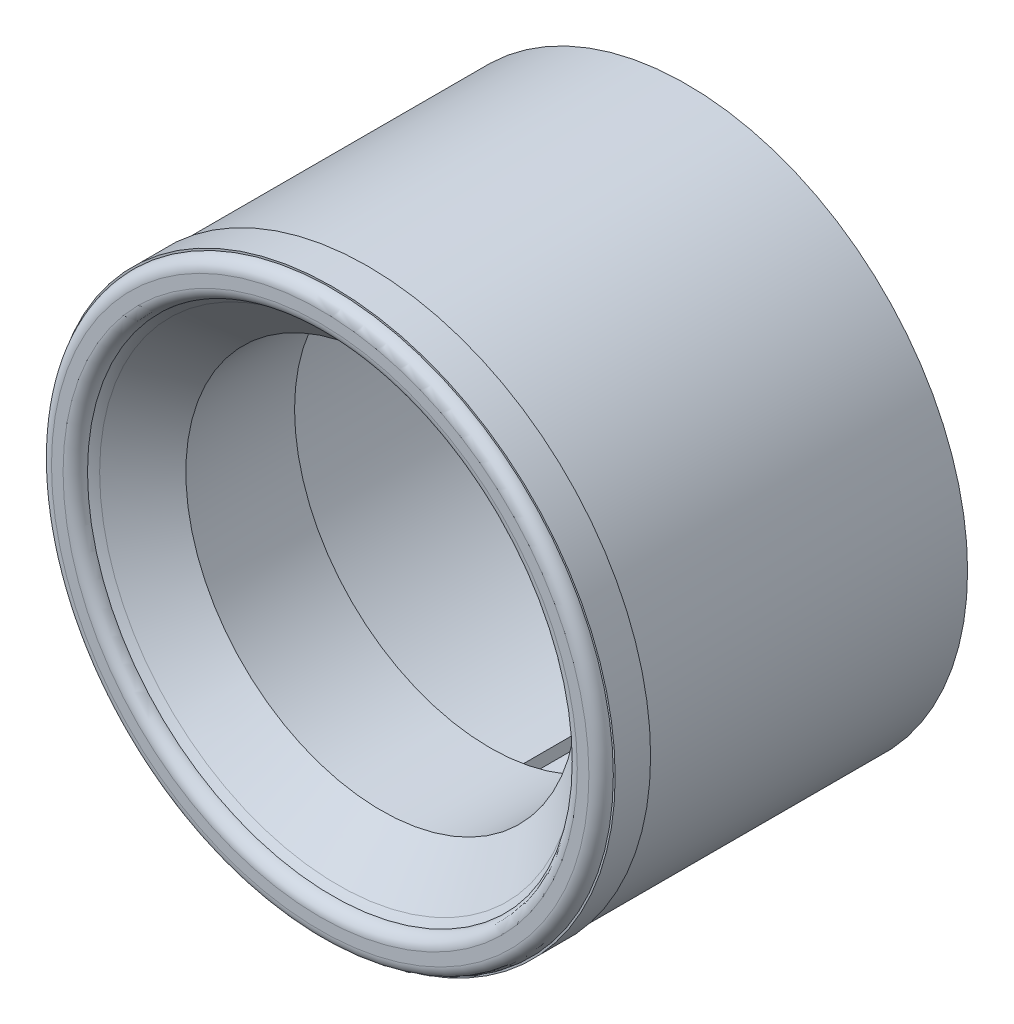
ISO-10303-21;
HEADER;
FILE_DESCRIPTION(('STEP AP214'),'2;1');
FILE_NAME('part.step','',(''),(''),'','','');
FILE_SCHEMA(('AUTOMOTIVE_DESIGN { 1 0 10303 214 1 1 1 1 }'));
ENDSEC;
DATA;
#1=APPLICATION_CONTEXT('core data for automotive mechanical design processes');
#2=APPLICATION_PROTOCOL_DEFINITION('international standard','automotive_design',2000,#1);
#3=PRODUCT_CONTEXT('',#1,'mechanical');
#4=PRODUCT('Part','Part','',(#3));
#5=PRODUCT_RELATED_PRODUCT_CATEGORY('part','',(#4));
#6=PRODUCT_DEFINITION_FORMATION('','',#4);
#7=PRODUCT_DEFINITION_CONTEXT('part definition',#1,'design');
#8=PRODUCT_DEFINITION('design','',#6,#7);
#9=PRODUCT_DEFINITION_SHAPE('','',#8);
#10=(LENGTH_UNIT() NAMED_UNIT(*) SI_UNIT(.MILLI.,.METRE.));
#11=(NAMED_UNIT(*) PLANE_ANGLE_UNIT() SI_UNIT($,.RADIAN.));
#12=(NAMED_UNIT(*) SI_UNIT($,.STERADIAN.) SOLID_ANGLE_UNIT());
#13=UNCERTAINTY_MEASURE_WITH_UNIT(LENGTH_MEASURE(1.E-05),#10,'distance_accuracy_value','');
#14=(GEOMETRIC_REPRESENTATION_CONTEXT(3) GLOBAL_UNCERTAINTY_ASSIGNED_CONTEXT((#13)) GLOBAL_UNIT_ASSIGNED_CONTEXT((#10,
#11,#12)) REPRESENTATION_CONTEXT('',''));
#15=CARTESIAN_POINT('',(0.,0.,0.));
#16=DIRECTION('',(0.,0.,1.));
#17=DIRECTION('',(1.,0.,0.));
#18=AXIS2_PLACEMENT_3D('',#15,#16,#17);
#19=CARTESIAN_POINT('',(0.,0.,26.1));
#20=DIRECTION('',(0.,0.,1.));
#21=DIRECTION('',(1.,0.,0.));
#22=AXIS2_PLACEMENT_3D('',#19,#20,#21);
#23=PLANE('',#22);
#24=CARTESIAN_POINT('',(0.,0.,26.1));
#25=DIRECTION('',(0.,0.,1.));
#26=DIRECTION('',(1.,0.,0.));
#27=AXIS2_PLACEMENT_3D('',#24,#25,#26);
#28=CIRCLE('',#27,20.05);
#29=CARTESIAN_POINT('',(20.05,0.,26.1));
#30=VERTEX_POINT('',#29);
#31=EDGE_CURVE('E121',#30,#30,#28,.T.);
#32=ORIENTED_EDGE('',*,*,#31,.F.);
#33=EDGE_LOOP('',(#32));
#34=FACE_BOUND('',#33,.T.);
#35=CARTESIAN_POINT('',(0.,0.,26.1));
#36=DIRECTION('',(0.,0.,1.));
#37=DIRECTION('',(1.,0.,0.));
#38=AXIS2_PLACEMENT_3D('',#35,#36,#37);
#39=CIRCLE('',#38,17.425);
#40=CARTESIAN_POINT('',(17.425,0.,26.1));
#41=VERTEX_POINT('',#40);
#42=EDGE_CURVE('E420',#41,#41,#39,.F.);
#43=ORIENTED_EDGE('',*,*,#42,.F.);
#44=EDGE_LOOP('',(#43));
#45=FACE_BOUND('',#44,.T.);
#46=ADVANCED_FACE('F33',(#34,#45),#23,.F.);
#47=CARTESIAN_POINT('',(0.,0.,30.));
#48=DIRECTION('',(0.,0.,-1.));
#49=DIRECTION('',(-1.,0.,0.));
#50=AXIS2_PLACEMENT_3D('',#47,#48,#49);
#51=CYLINDRICAL_SURFACE('',#50,20.05);
#52=DIRECTION('',(0.,0.,-1.));
#53=VECTOR('',#52,1.);
#54=CARTESIAN_POINT('',(1.5,-19.9938115425749,30.));
#55=LINE('',#54,#53);
#56=CARTESIAN_POINT('',(1.5,-19.9938115425749,0.500000000000007));
#57=VERTEX_POINT('',#56);
#58=CARTESIAN_POINT('',(1.5,-19.9938115425749,26.));
#59=VERTEX_POINT('',#58);
#60=EDGE_CURVE('E48',#57,#59,#55,.F.);
#61=ORIENTED_EDGE('',*,*,#60,.T.);
#62=CARTESIAN_POINT('',(0.,0.,26.));
#63=DIRECTION('',(0.,0.,1.));
#64=DIRECTION('',(1.,0.,0.));
#65=AXIS2_PLACEMENT_3D('',#62,#63,#64);
#66=CIRCLE('',#65,20.05);
#67=CARTESIAN_POINT('',(-1.5,-19.9938115425749,26.));
#68=VERTEX_POINT('',#67);
#69=EDGE_CURVE('E250',#59,#68,#66,.F.);
#70=ORIENTED_EDGE('',*,*,#69,.T.);
#71=DIRECTION('',(0.,0.,-1.));
#72=VECTOR('',#71,1.);
#73=CARTESIAN_POINT('',(-1.5,-19.9938115425749,30.));
#74=LINE('',#73,#72);
#75=CARTESIAN_POINT('',(-1.5,-19.9938115425749,0.500000000000009));
#76=VERTEX_POINT('',#75);
#77=EDGE_CURVE('E56',#68,#76,#74,.T.);
#78=ORIENTED_EDGE('',*,*,#77,.T.);
#79=CARTESIAN_POINT('',(0.,0.,0.500000000000007));
#80=DIRECTION('',(0.,0.,1.));
#81=DIRECTION('',(1.,0.,0.));
#82=AXIS2_PLACEMENT_3D('',#79,#80,#81);
#83=CIRCLE('',#82,20.05);
#84=EDGE_CURVE('E144',#76,#57,#83,.F.);
#85=ORIENTED_EDGE('',*,*,#84,.T.);
#86=EDGE_LOOP('',(#61,#70,#78,#85));
#87=FACE_BOUND('',#86,.T.);
#88=ORIENTED_EDGE('',*,*,#31,.T.);
#89=EDGE_LOOP('',(#88));
#90=FACE_BOUND('',#89,.T.);
#91=ADVANCED_FACE('F206',(#87,#90),#51,.F.);
#92=CARTESIAN_POINT('',(0.,0.,30.));
#93=DIRECTION('',(0.,0.,-1.));
#94=DIRECTION('',(-1.,0.,0.));
#95=AXIS2_PLACEMENT_3D('',#92,#93,#94);
#96=CYLINDRICAL_SURFACE('',#95,23.);
#97=CARTESIAN_POINT('',(0.,0.,0.));
#98=DIRECTION('',(0.,0.,1.));
#99=DIRECTION('',(1.,0.,0.));
#100=AXIS2_PLACEMENT_3D('',#97,#98,#99);
#101=CIRCLE('',#100,23.);
#102=CARTESIAN_POINT('',(23.,0.,0.));
#103=VERTEX_POINT('',#102);
#104=EDGE_CURVE('E126',#103,#103,#101,.T.);
#105=ORIENTED_EDGE('',*,*,#104,.T.);
#106=EDGE_LOOP('',(#105));
#107=FACE_BOUND('',#106,.T.);
#108=CARTESIAN_POINT('',(0.,0.,26.1));
#109=DIRECTION('',(0.,0.,1.));
#110=DIRECTION('',(1.,0.,0.));
#111=AXIS2_PLACEMENT_3D('',#108,#109,#110);
#112=CIRCLE('',#111,23.);
#113=CARTESIAN_POINT('',(23.,0.,26.1));
#114=VERTEX_POINT('',#113);
#115=EDGE_CURVE('E178',#114,#114,#112,.T.);
#116=ORIENTED_EDGE('',*,*,#115,.F.);
#117=EDGE_LOOP('',(#116));
#118=FACE_BOUND('',#117,.T.);
#119=ADVANCED_FACE('F212',(#107,#118),#96,.T.);
#120=CARTESIAN_POINT('',(0.,0.,25.));
#121=DIRECTION('',(0.,0.,1.));
#122=DIRECTION('',(1.,0.,0.));
#123=AXIS2_PLACEMENT_3D('',#120,#121,#122);
#124=PLANE('',#123);
#125=DIRECTION('',(0.,-1.,0.));
#126=VECTOR('',#125,1.);
#127=CARTESIAN_POINT('',(-1.5,-19.05,25.));
#128=LINE('',#127,#126);
#129=CARTESIAN_POINT('',(-1.5,-20.9964878015348,25.));
#130=VERTEX_POINT('',#129);
#131=CARTESIAN_POINT('',(-1.5,-21.05,25.));
#132=VERTEX_POINT('',#131);
#133=EDGE_CURVE('E87',#130,#132,#128,.T.);
#134=ORIENTED_EDGE('',*,*,#133,.F.);
#135=CARTESIAN_POINT('',(0.,0.,25.));
#136=DIRECTION('',(0.,0.,1.));
#137=DIRECTION('',(1.,0.,0.));
#138=AXIS2_PLACEMENT_3D('',#135,#136,#137);
#139=CIRCLE('',#138,21.05);
#140=CARTESIAN_POINT('',(0.,-21.05,25.));
#141=VERTEX_POINT('',#140);
#142=EDGE_CURVE('E111',#130,#141,#139,.T.);
#143=ORIENTED_EDGE('',*,*,#142,.T.);
#144=DIRECTION('',(1.,0.,0.));
#145=VECTOR('',#144,1.);
#146=CARTESIAN_POINT('',(-1.5,-21.05,25.));
#147=LINE('',#146,#145);
#148=EDGE_CURVE('E104',#132,#141,#147,.T.);
#149=ORIENTED_EDGE('',*,*,#148,.F.);
#150=EDGE_LOOP('',(#134,#143,#149));
#151=FACE_BOUND('',#150,.T.);
#152=ADVANCED_FACE('F110',(#151),#124,.F.);
#153=CARTESIAN_POINT('',(0.,0.,0.));
#154=DIRECTION('',(0.,0.,1.));
#155=DIRECTION('',(1.,0.,0.));
#156=AXIS2_PLACEMENT_3D('',#153,#154,#155);
#157=PLANE('',#156);
#158=ORIENTED_EDGE('',*,*,#104,.F.);
#159=EDGE_LOOP('',(#158));
#160=FACE_BOUND('',#159,.T.);
#161=DIRECTION('',(0.,1.,0.));
#162=VECTOR('',#161,1.);
#163=CARTESIAN_POINT('',(1.5,-19.05,0.));
#164=LINE('',#163,#162);
#165=CARTESIAN_POINT('',(1.5,-21.05,0.));
#166=VERTEX_POINT('',#165);
#167=CARTESIAN_POINT('',(1.5,-20.4951823607403,0.));
#168=VERTEX_POINT('',#167);
#169=EDGE_CURVE('E117',#166,#168,#164,.T.);
#170=ORIENTED_EDGE('',*,*,#169,.T.);
#171=CARTESIAN_POINT('',(0.,0.,0.));
#172=DIRECTION('',(0.,0.,1.));
#173=DIRECTION('',(1.,0.,0.));
#174=AXIS2_PLACEMENT_3D('',#171,#172,#173);
#175=CIRCLE('',#174,20.55);
#176=CARTESIAN_POINT('',(-1.5,-20.4951823607403,0.));
#177=VERTEX_POINT('',#176);
#178=EDGE_CURVE('E141',#168,#177,#175,.T.);
#179=ORIENTED_EDGE('',*,*,#178,.T.);
#180=DIRECTION('',(0.,-1.,0.));
#181=VECTOR('',#180,1.);
#182=CARTESIAN_POINT('',(-1.5,-19.05,0.));
#183=LINE('',#182,#181);
#184=CARTESIAN_POINT('',(-1.5,-21.05,0.));
#185=VERTEX_POINT('',#184);
#186=EDGE_CURVE('E120',#177,#185,#183,.T.);
#187=ORIENTED_EDGE('',*,*,#186,.T.);
#188=DIRECTION('',(1.,0.,0.));
#189=VECTOR('',#188,1.);
#190=CARTESIAN_POINT('',(-1.5,-21.05,0.));
#191=LINE('',#190,#189);
#192=EDGE_CURVE('E106',#185,#166,#191,.T.);
#193=ORIENTED_EDGE('',*,*,#192,.T.);
#194=EDGE_LOOP('',(#170,#179,#187,#193));
#195=FACE_BOUND('',#194,.T.);
#196=ADVANCED_FACE('F258',(#160,#195),#157,.F.);
#197=CARTESIAN_POINT('',(0.,0.,0.));
#198=DIRECTION('',(0.,0.,-1.));
#199=DIRECTION('',(-1.,0.,0.));
#200=AXIS2_PLACEMENT_3D('',#197,#198,#199);
#201=CONICAL_SURFACE('',#200,20.55,0.785398163397438);
#202=ORIENTED_EDGE('',*,*,#178,.F.);
#203=CARTESIAN_POINT('',(1.5,-22.4903904809033,-1.99035634109423));
#204=CARTESIAN_POINT('',(1.5,-21.7615888523124,-1.26312854031562));
#205=CARTESIAN_POINT('',(1.5,-21.0326797089882,-0.536008550704387));
#206=CARTESIAN_POINT('',(1.5,-19.5746463894473,0.918015809599295));
#207=CARTESIAN_POINT('',(1.5,-18.8455222132297,1.64492018029074));
#208=CARTESIAN_POINT('',(1.5,-18.1162905222777,2.37171673981378));
#209=B_SPLINE_CURVE_WITH_KNOTS('',3,(#203,#204,#205,#206,#207,#208),.UNSPECIFIED.,.F.,.F.,(4,2,
4),(0.,3.08870655236552,6.17741311924391),.UNSPECIFIED.);
#210=EDGE_CURVE('E154',#168,#57,#209,.T.);
#211=ORIENTED_EDGE('',*,*,#210,.T.);
#212=ORIENTED_EDGE('',*,*,#84,.F.);
#213=CARTESIAN_POINT('',(-1.5,-18.1162905222777,2.37171673981378));
#214=CARTESIAN_POINT('',(-1.5,-18.8455222132297,1.64492018029074));
#215=CARTESIAN_POINT('',(-1.5,-19.5746463894473,0.918015809599294));
#216=CARTESIAN_POINT('',(-1.5,-21.0326797089882,-0.536008550704389));
#217=CARTESIAN_POINT('',(-1.5,-21.7615888523124,-1.26312854031562));
#218=CARTESIAN_POINT('',(-1.5,-22.4903904809033,-1.99035634109423));
#219=B_SPLINE_CURVE_WITH_KNOTS('',3,(#213,#214,#215,#216,#217,#218),.UNSPECIFIED.,.F.,.F.,(4,2,
4),(0.,3.08870656687838,6.1774131192439),.UNSPECIFIED.);
#220=EDGE_CURVE('E146',#76,#177,#219,.T.);
#221=ORIENTED_EDGE('',*,*,#220,.T.);
#222=EDGE_LOOP('',(#202,#211,#212,#221));
#223=FACE_BOUND('',#222,.T.);
#224=ADVANCED_FACE('F160',(#223),#201,.F.);
#225=CARTESIAN_POINT('',(1.5,-19.05,25.));
#226=DIRECTION('',(-1.,0.,0.));
#227=DIRECTION('',(0.,-1.,0.));
#228=AXIS2_PLACEMENT_3D('',#225,#226,#227);
#229=PLANE('',#228);
#230=ORIENTED_EDGE('',*,*,#210,.F.);
#231=ORIENTED_EDGE('',*,*,#169,.F.);
#232=DIRECTION('',(0.,0.,-1.));
#233=VECTOR('',#232,1.);
#234=CARTESIAN_POINT('',(1.5,-21.05,25.));
#235=LINE('',#234,#233);
#236=CARTESIAN_POINT('',(1.5,-21.05,25.));
#237=VERTEX_POINT('',#236);
#238=EDGE_CURVE('E108',#237,#166,#235,.T.);
#239=ORIENTED_EDGE('',*,*,#238,.F.);
#240=DIRECTION('',(0.,1.,0.));
#241=VECTOR('',#240,1.);
#242=CARTESIAN_POINT('',(1.5,-19.05,25.));
#243=LINE('',#242,#241);
#244=CARTESIAN_POINT('',(1.5,-20.9964878015348,25.));
#245=VERTEX_POINT('',#244);
#246=EDGE_CURVE('E99',#237,#245,#243,.T.);
#247=ORIENTED_EDGE('',*,*,#246,.T.);
#248=CARTESIAN_POINT('',(1.5,-20.9964878015348,25.));
#249=CARTESIAN_POINT('',(1.5,-20.8293859588275,25.1666775628606));
#250=CARTESIAN_POINT('',(1.5,-20.6622786825627,25.3333496776221));
#251=CARTESIAN_POINT('',(1.5,-20.3280532629094,25.6666830109555));
#252=CARTESIAN_POINT('',(1.5,-20.1609351195209,25.8333442295273));
#253=CARTESIAN_POINT('',(1.5,-19.9938115425749,26.));
#254=B_SPLINE_CURVE_WITH_KNOTS('',3,(#248,#249,#250,#251,#252,#253),.UNSPECIFIED.,.F.,.F.,(4,2,
4),(0.,0.708053614196981,1.41610722843058),.UNSPECIFIED.);
#255=EDGE_CURVE('E179',#245,#59,#254,.T.);
#256=ORIENTED_EDGE('',*,*,#255,.T.);
#257=ORIENTED_EDGE('',*,*,#60,.F.);
#258=EDGE_LOOP('',(#230,#231,#239,#247,#256,#257));
#259=FACE_BOUND('',#258,.T.);
#260=ADVANCED_FACE('F167',(#259),#229,.T.);
#261=CARTESIAN_POINT('',(-1.5,-19.05,25.));
#262=DIRECTION('',(1.,0.,0.));
#263=DIRECTION('',(0.,1.,0.));
#264=AXIS2_PLACEMENT_3D('',#261,#262,#263);
#265=PLANE('',#264);
#266=ORIENTED_EDGE('',*,*,#77,.F.);
#267=CARTESIAN_POINT('',(-1.5,-19.9938115425749,26.));
#268=CARTESIAN_POINT('',(-1.5,-20.1609351195209,25.8333442295273));
#269=CARTESIAN_POINT('',(-1.5,-20.3280532629094,25.6666830109555));
#270=CARTESIAN_POINT('',(-1.5,-20.6622786825627,25.3333496776221));
#271=CARTESIAN_POINT('',(-1.5,-20.8293859588275,25.1666775628606));
#272=CARTESIAN_POINT('',(-1.5,-20.9964878015348,25.));
#273=B_SPLINE_CURVE_WITH_KNOTS('',3,(#267,#268,#269,#270,#271,#272),.UNSPECIFIED.,.F.,.F.,(4,2,
4),(0.,0.708053614233599,1.41610722843058),.UNSPECIFIED.);
#274=EDGE_CURVE('E93',#68,#130,#273,.T.);
#275=ORIENTED_EDGE('',*,*,#274,.T.);
#276=ORIENTED_EDGE('',*,*,#133,.T.);
#277=DIRECTION('',(0.,0.,-1.));
#278=VECTOR('',#277,1.);
#279=CARTESIAN_POINT('',(-1.5,-21.05,25.));
#280=LINE('',#279,#278);
#281=EDGE_CURVE('E90',#132,#185,#280,.T.);
#282=ORIENTED_EDGE('',*,*,#281,.T.);
#283=ORIENTED_EDGE('',*,*,#186,.F.);
#284=ORIENTED_EDGE('',*,*,#220,.F.);
#285=EDGE_LOOP('',(#266,#275,#276,#282,#283,#284));
#286=FACE_BOUND('',#285,.T.);
#287=ADVANCED_FACE('F89',(#286),#265,.T.);
#288=CARTESIAN_POINT('',(-1.5,-21.05,25.));
#289=DIRECTION('',(0.,1.,0.));
#290=DIRECTION('',(0.,0.,1.));
#291=AXIS2_PLACEMENT_3D('',#288,#289,#290);
#292=PLANE('',#291);
#293=ORIENTED_EDGE('',*,*,#192,.F.);
#294=ORIENTED_EDGE('',*,*,#281,.F.);
#295=ORIENTED_EDGE('',*,*,#148,.T.);
#296=EDGE_CURVE('E98',#141,#237,#147,.T.);
#297=ORIENTED_EDGE('',*,*,#296,.T.);
#298=ORIENTED_EDGE('',*,*,#238,.T.);
#299=EDGE_LOOP('',(#293,#294,#295,#297,#298));
#300=FACE_BOUND('',#299,.T.);
#301=ADVANCED_FACE('F103',(#300),#292,.T.);
#302=ORIENTED_EDGE('',*,*,#296,.F.);
#303=CARTESIAN_POINT('',(0.,0.,25.));
#304=DIRECTION('',(0.,0.,1.));
#305=DIRECTION('',(1.,0.,0.));
#306=AXIS2_PLACEMENT_3D('',#303,#304,#305);
#307=CIRCLE('',#306,21.05);
#308=EDGE_CURVE('E249',#141,#245,#307,.T.);
#309=ORIENTED_EDGE('',*,*,#308,.T.);
#310=ORIENTED_EDGE('',*,*,#246,.F.);
#311=EDGE_LOOP('',(#302,#309,#310));
#312=FACE_BOUND('',#311,.T.);
#313=ADVANCED_FACE('F189',(#312),#124,.F.);
#314=CARTESIAN_POINT('',(0.,0.,25.));
#315=DIRECTION('',(0.,0.,-1.));
#316=DIRECTION('',(-1.,0.,0.));
#317=AXIS2_PLACEMENT_3D('',#314,#315,#316);
#318=CONICAL_SURFACE('',#317,21.05,0.785398163397447);
#319=ORIENTED_EDGE('',*,*,#274,.F.);
#320=ORIENTED_EDGE('',*,*,#69,.F.);
#321=ORIENTED_EDGE('',*,*,#255,.F.);
#322=ORIENTED_EDGE('',*,*,#308,.F.);
#323=ORIENTED_EDGE('',*,*,#142,.F.);
#324=EDGE_LOOP('',(#319,#320,#321,#322,#323));
#325=FACE_BOUND('',#324,.T.);
#326=ADVANCED_FACE('F185',(#325),#318,.F.);
#327=ORIENTED_EDGE('',*,*,#115,.T.);
#328=EDGE_LOOP('',(#327));
#329=FACE_BOUND('',#328,.T.);
#330=CARTESIAN_POINT('',(0.,0.,26.1));
#331=DIRECTION('',(0.,0.,1.));
#332=DIRECTION('',(1.,0.,0.));
#333=AXIS2_PLACEMENT_3D('',#330,#331,#332);
#334=CIRCLE('',#333,23.15);
#335=CARTESIAN_POINT('',(23.15,0.,26.1));
#336=VERTEX_POINT('',#335);
#337=EDGE_CURVE('E231',#336,#336,#334,.T.);
#338=ORIENTED_EDGE('',*,*,#337,.F.);
#339=EDGE_LOOP('',(#338));
#340=FACE_BOUND('',#339,.T.);
#341=ADVANCED_FACE('F188',(#329,#340),#23,.F.);
#342=CARTESIAN_POINT('',(0.,0.,26.1));
#343=DIRECTION('',(0.,0.,1.));
#344=DIRECTION('',(1.,0.,0.));
#345=AXIS2_PLACEMENT_3D('',#342,#343,#344);
#346=CYLINDRICAL_SURFACE('',#345,23.15);
#347=ORIENTED_EDGE('',*,*,#337,.T.);
#348=EDGE_LOOP('',(#347));
#349=FACE_BOUND('',#348,.T.);
#350=CARTESIAN_POINT('',(0.,0.,29.));
#351=DIRECTION('',(0.,0.,1.));
#352=DIRECTION('',(1.,0.,0.));
#353=AXIS2_PLACEMENT_3D('',#350,#351,#352);
#354=CIRCLE('',#353,23.15);
#355=CARTESIAN_POINT('',(23.15,0.,29.));
#356=VERTEX_POINT('',#355);
#357=EDGE_CURVE('E232',#356,#356,#354,.T.);
#358=ORIENTED_EDGE('',*,*,#357,.F.);
#359=EDGE_LOOP('',(#358));
#360=FACE_BOUND('',#359,.T.);
#361=ADVANCED_FACE('F218',(#349,#360),#346,.T.);
#362=CARTESIAN_POINT('',(0.,0.,29.));
#363=DIRECTION('',(0.,0.,1.));
#364=DIRECTION('',(1.,0.,0.));
#365=AXIS2_PLACEMENT_3D('',#362,#363,#364);
#366=PLANE('',#365);
#367=CARTESIAN_POINT('',(0.,0.,29.));
#368=DIRECTION('',(0.,0.,1.));
#369=DIRECTION('',(1.,0.,0.));
#370=AXIS2_PLACEMENT_3D('',#367,#368,#369);
#371=CIRCLE('',#370,23.);
#372=CARTESIAN_POINT('',(23.,0.,29.));
#373=VERTEX_POINT('',#372);
#374=EDGE_CURVE('E138',#373,#373,#371,.F.);
#375=ORIENTED_EDGE('',*,*,#374,.T.);
#376=EDGE_LOOP('',(#375));
#377=FACE_BOUND('',#376,.T.);
#378=ORIENTED_EDGE('',*,*,#357,.T.);
#379=EDGE_LOOP('',(#378));
#380=FACE_BOUND('',#379,.T.);
#381=ADVANCED_FACE('F223',(#377,#380),#366,.T.);
#382=CARTESIAN_POINT('',(0.,0.,29.));
#383=DIRECTION('',(0.,0.,1.));
#384=DIRECTION('',(1.,0.,0.));
#385=AXIS2_PLACEMENT_3D('',#382,#383,#384);
#386=TOROIDAL_SURFACE('',#385,21.05,1.);
#387=CARTESIAN_POINT('',(0.,0.,30.));
#388=DIRECTION('',(0.,0.,1.));
#389=DIRECTION('',(1.,0.,0.));
#390=AXIS2_PLACEMENT_3D('',#387,#388,#389);
#391=CIRCLE('',#390,21.05);
#392=CARTESIAN_POINT('',(21.05,0.,30.));
#393=VERTEX_POINT('',#392);
#394=EDGE_CURVE('E135',#393,#393,#391,.F.);
#395=ORIENTED_EDGE('',*,*,#394,.F.);
#396=EDGE_LOOP('',(#395));
#397=FACE_BOUND('',#396,.T.);
#398=CARTESIAN_POINT('',(0.,0.,29.));
#399=DIRECTION('',(0.,0.,1.));
#400=DIRECTION('',(1.,0.,0.));
#401=AXIS2_PLACEMENT_3D('',#398,#399,#400);
#402=CIRCLE('',#401,20.05);
#403=CARTESIAN_POINT('',(20.05,0.,29.));
#404=VERTEX_POINT('',#403);
#405=EDGE_CURVE('E129',#404,#404,#402,.T.);
#406=ORIENTED_EDGE('',*,*,#405,.F.);
#407=EDGE_LOOP('',(#406));
#408=FACE_BOUND('',#407,.T.);
#409=ADVANCED_FACE('F273',(#397,#408),#386,.T.);
#410=CARTESIAN_POINT('',(0.,0.,30.));
#411=DIRECTION('',(0.,0.,1.));
#412=DIRECTION('',(1.,0.,0.));
#413=AXIS2_PLACEMENT_3D('',#410,#411,#412);
#414=PLANE('',#413);
#415=ORIENTED_EDGE('',*,*,#394,.T.);
#416=EDGE_LOOP('',(#415));
#417=FACE_BOUND('',#416,.T.);
#418=CARTESIAN_POINT('',(0.,0.,30.));
#419=DIRECTION('',(0.,0.,1.));
#420=DIRECTION('',(1.,0.,0.));
#421=AXIS2_PLACEMENT_3D('',#418,#419,#420);
#422=CIRCLE('',#421,22.);
#423=CARTESIAN_POINT('',(22.,0.,30.));
#424=VERTEX_POINT('',#423);
#425=EDGE_CURVE('E132',#424,#424,#422,.T.);
#426=ORIENTED_EDGE('',*,*,#425,.T.);
#427=EDGE_LOOP('',(#426));
#428=FACE_BOUND('',#427,.T.);
#429=ADVANCED_FACE('F269',(#417,#428),#414,.T.);
#430=CARTESIAN_POINT('',(0.,0.,29.));
#431=DIRECTION('',(0.,0.,1.));
#432=DIRECTION('',(1.,0.,0.));
#433=AXIS2_PLACEMENT_3D('',#430,#431,#432);
#434=TOROIDAL_SURFACE('',#433,22.,1.);
#435=ORIENTED_EDGE('',*,*,#374,.F.);
#436=EDGE_LOOP('',(#435));
#437=FACE_BOUND('',#436,.T.);
#438=ORIENTED_EDGE('',*,*,#425,.F.);
#439=EDGE_LOOP('',(#438));
#440=FACE_BOUND('',#439,.T.);
#441=ADVANCED_FACE('F276',(#437,#440),#434,.T.);
#442=CARTESIAN_POINT('',(0.,0.,26.1));
#443=DIRECTION('',(0.,0.,1.));
#444=DIRECTION('',(1.,0.,0.));
#445=AXIS2_PLACEMENT_3D('',#442,#443,#444);
#446=CYLINDRICAL_SURFACE('',#445,16.);
#447=CARTESIAN_POINT('',(0.,0.,25.));
#448=DIRECTION('',(0.,0.,1.));
#449=DIRECTION('',(1.,0.,0.));
#450=AXIS2_PLACEMENT_3D('',#447,#448,#449);
#451=CIRCLE('',#450,16.);
#452=CARTESIAN_POINT('',(16.,0.,25.));
#453=VERTEX_POINT('',#452);
#454=EDGE_CURVE('E41',#453,#453,#451,.T.);
#455=ORIENTED_EDGE('',*,*,#454,.T.);
#456=EDGE_LOOP('',(#455));
#457=FACE_BOUND('',#456,.T.);
#458=CARTESIAN_POINT('',(0.,0.,16.1));
#459=DIRECTION('',(0.,0.,-1.));
#460=DIRECTION('',(-1.,0.,0.));
#461=AXIS2_PLACEMENT_3D('',#458,#459,#460);
#462=CIRCLE('',#461,16.);
#463=CARTESIAN_POINT('',(-16.,0.,16.1));
#464=VERTEX_POINT('',#463);
#465=EDGE_CURVE('E415',#464,#464,#462,.T.);
#466=ORIENTED_EDGE('',*,*,#465,.T.);
#467=EDGE_LOOP('',(#466));
#468=FACE_BOUND('',#467,.T.);
#469=ADVANCED_FACE('F278',(#457,#468),#446,.F.);
#470=CARTESIAN_POINT('',(0.,0.,16.1));
#471=DIRECTION('',(0.,0.,-1.));
#472=DIRECTION('',(-1.,0.,0.));
#473=AXIS2_PLACEMENT_3D('',#470,#471,#472);
#474=PLANE('',#473);
#475=CARTESIAN_POINT('',(0.,0.,16.1));
#476=DIRECTION('',(0.,0.,-1.));
#477=DIRECTION('',(-1.,0.,0.));
#478=AXIS2_PLACEMENT_3D('',#475,#476,#477);
#479=CIRCLE('',#478,17.425);
#480=CARTESIAN_POINT('',(-17.425,0.,16.1));
#481=VERTEX_POINT('',#480);
#482=EDGE_CURVE('E237',#481,#481,#479,.T.);
#483=ORIENTED_EDGE('',*,*,#482,.T.);
#484=EDGE_LOOP('',(#483));
#485=FACE_BOUND('',#484,.T.);
#486=ORIENTED_EDGE('',*,*,#465,.F.);
#487=EDGE_LOOP('',(#486));
#488=FACE_BOUND('',#487,.T.);
#489=ADVANCED_FACE('F201',(#485,#488),#474,.T.);
#490=CARTESIAN_POINT('',(0.,0.,16.1));
#491=DIRECTION('',(0.,0.,1.));
#492=DIRECTION('',(1.,0.,0.));
#493=AXIS2_PLACEMENT_3D('',#490,#491,#492);
#494=CYLINDRICAL_SURFACE('',#493,17.425);
#495=ORIENTED_EDGE('',*,*,#482,.F.);
#496=EDGE_LOOP('',(#495));
#497=FACE_BOUND('',#496,.T.);
#498=ORIENTED_EDGE('',*,*,#42,.T.);
#499=EDGE_LOOP('',(#498));
#500=FACE_BOUND('',#499,.T.);
#501=ADVANCED_FACE('F194',(#497,#500),#494,.T.);
#502=CARTESIAN_POINT('',(0.,0.,25.));
#503=DIRECTION('',(0.,0.,1.));
#504=DIRECTION('',(1.,0.,0.));
#505=AXIS2_PLACEMENT_3D('',#502,#503,#504);
#506=CONICAL_SURFACE('',#505,16.,0.785398163397448);
#507=CARTESIAN_POINT('',(0.,0.,28.528147533552));
#508=DIRECTION('',(0.,0.,1.));
#509=DIRECTION('',(1.,0.,0.));
#510=AXIS2_PLACEMENT_3D('',#507,#508,#509);
#511=CIRCLE('',#510,19.528147533552);
#512=CARTESIAN_POINT('',(19.528147533552,0.,28.528147533552));
#513=VERTEX_POINT('',#512);
#514=EDGE_CURVE('E11',#513,#513,#511,.T.);
#515=ORIENTED_EDGE('',*,*,#514,.T.);
#516=EDGE_LOOP('',(#515));
#517=FACE_BOUND('',#516,.T.);
#518=ORIENTED_EDGE('',*,*,#454,.F.);
#519=EDGE_LOOP('',(#518));
#520=FACE_BOUND('',#519,.T.);
#521=ADVANCED_FACE('F191',(#517,#520),#506,.F.);
#522=CARTESIAN_POINT('',(0.,0.,23.5784000652461));
#523=DIRECTION('',(0.,0.,1.));
#524=DIRECTION('',(1.,0.,0.));
#525=AXIS2_PLACEMENT_3D('',#522,#523,#524);
#526=TOROIDAL_SURFACE('',#525,24.4778950018578,7.);
#527=ORIENTED_EDGE('',*,*,#514,.F.);
#528=EDGE_LOOP('',(#527));
#529=FACE_BOUND('',#528,.T.);
#530=ORIENTED_EDGE('',*,*,#405,.T.);
#531=EDGE_LOOP('',(#530));
#532=FACE_BOUND('',#531,.T.);
#533=ADVANCED_FACE('F35',(#529,#532),#526,.T.);
#534=CLOSED_SHELL('',(#46,#91,#119,#152,#196,#224,#260,#287,#301,#313,#326,#341,#361,#381,#409,
#429,#441,#469,#489,#501,#521,#533));
#535=MANIFOLD_SOLID_BREP('B2',#534);
#536=ADVANCED_BREP_SHAPE_REPRESENTATION('',(#18,#535),#14);
#537=SHAPE_DEFINITION_REPRESENTATION(#9,#536);
ENDSEC;
END-ISO-10303-21;
